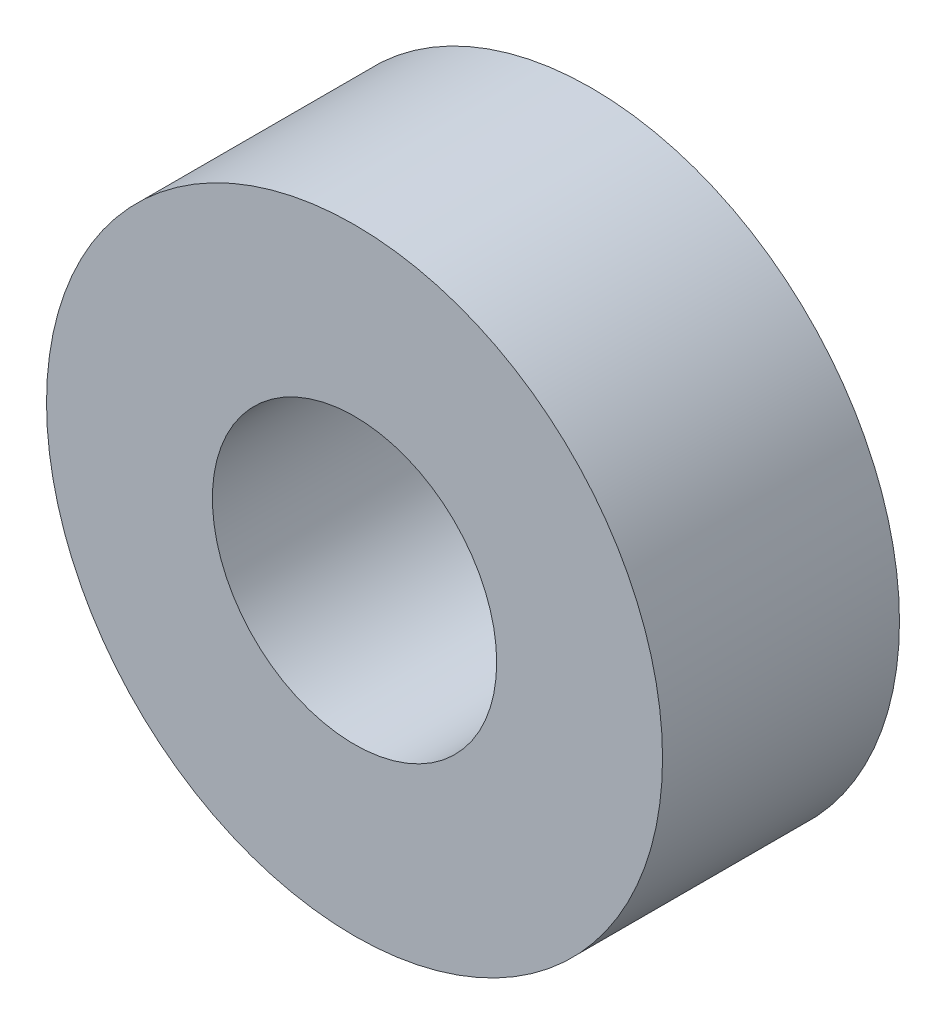
ISO-10303-21;
HEADER;
FILE_DESCRIPTION(('STEP AP214'),'2;1');
FILE_NAME('part.step','',(''),(''),'','','');
FILE_SCHEMA(('AUTOMOTIVE_DESIGN { 1 0 10303 214 1 1 1 1 }'));
ENDSEC;
DATA;
#1=APPLICATION_CONTEXT('core data for automotive mechanical design processes');
#2=APPLICATION_PROTOCOL_DEFINITION('international standard','automotive_design',2000,#1);
#3=PRODUCT_CONTEXT('',#1,'mechanical');
#4=PRODUCT('Part','Part','',(#3));
#5=PRODUCT_RELATED_PRODUCT_CATEGORY('part','',(#4));
#6=PRODUCT_DEFINITION_FORMATION('','',#4);
#7=PRODUCT_DEFINITION_CONTEXT('part definition',#1,'design');
#8=PRODUCT_DEFINITION('design','',#6,#7);
#9=PRODUCT_DEFINITION_SHAPE('','',#8);
#10=(LENGTH_UNIT() NAMED_UNIT(*) SI_UNIT(.MILLI.,.METRE.));
#11=(NAMED_UNIT(*) PLANE_ANGLE_UNIT() SI_UNIT($,.RADIAN.));
#12=(NAMED_UNIT(*) SI_UNIT($,.STERADIAN.) SOLID_ANGLE_UNIT());
#13=UNCERTAINTY_MEASURE_WITH_UNIT(LENGTH_MEASURE(1.E-05),#10,'distance_accuracy_value','');
#14=(GEOMETRIC_REPRESENTATION_CONTEXT(3) GLOBAL_UNCERTAINTY_ASSIGNED_CONTEXT((#13)) GLOBAL_UNIT_ASSIGNED_CONTEXT((#10,
#11,#12)) REPRESENTATION_CONTEXT('',''));
#15=CARTESIAN_POINT('',(0.,0.,0.));
#16=DIRECTION('',(0.,0.,1.));
#17=DIRECTION('',(1.,0.,0.));
#18=AXIS2_PLACEMENT_3D('',#15,#16,#17);
#19=CARTESIAN_POINT('',(0.,0.,5.));
#20=DIRECTION('',(0.,0.,-1.));
#21=DIRECTION('',(-1.,0.,0.));
#22=AXIS2_PLACEMENT_3D('',#19,#20,#21);
#23=CYLINDRICAL_SURFACE('',#22,6.5);
#24=CARTESIAN_POINT('',(0.,0.,5.));
#25=DIRECTION('',(0.,0.,1.));
#26=DIRECTION('',(1.,0.,0.));
#27=AXIS2_PLACEMENT_3D('',#24,#25,#26);
#28=CIRCLE('',#27,6.5);
#29=CARTESIAN_POINT('',(6.5,0.,5.));
#30=VERTEX_POINT('',#29);
#31=EDGE_CURVE('E10',#30,#30,#28,.T.);
#32=ORIENTED_EDGE('',*,*,#31,.F.);
#33=EDGE_LOOP('',(#32));
#34=FACE_BOUND('',#33,.T.);
#35=CARTESIAN_POINT('',(0.,0.,0.));
#36=DIRECTION('',(0.,0.,1.));
#37=DIRECTION('',(1.,0.,0.));
#38=AXIS2_PLACEMENT_3D('',#35,#36,#37);
#39=CIRCLE('',#38,6.5);
#40=CARTESIAN_POINT('',(6.5,0.,0.));
#41=VERTEX_POINT('',#40);
#42=EDGE_CURVE('E46',#41,#41,#39,.T.);
#43=ORIENTED_EDGE('',*,*,#42,.T.);
#44=EDGE_LOOP('',(#43));
#45=FACE_BOUND('',#44,.T.);
#46=ADVANCED_FACE('F43',(#34,#45),#23,.T.);
#47=CARTESIAN_POINT('',(0.,0.,5.));
#48=DIRECTION('',(0.,0.,1.));
#49=DIRECTION('',(1.,0.,0.));
#50=AXIS2_PLACEMENT_3D('',#47,#48,#49);
#51=PLANE('',#50);
#52=CARTESIAN_POINT('',(0.,0.,5.));
#53=DIRECTION('',(0.,0.,1.));
#54=DIRECTION('',(1.,0.,0.));
#55=AXIS2_PLACEMENT_3D('',#52,#53,#54);
#56=CIRCLE('',#55,3.);
#57=CARTESIAN_POINT('',(3.,0.,5.));
#58=VERTEX_POINT('',#57);
#59=EDGE_CURVE('E57',#58,#58,#56,.T.);
#60=ORIENTED_EDGE('',*,*,#59,.F.);
#61=EDGE_LOOP('',(#60));
#62=FACE_BOUND('',#61,.T.);
#63=ORIENTED_EDGE('',*,*,#31,.T.);
#64=EDGE_LOOP('',(#63));
#65=FACE_BOUND('',#64,.T.);
#66=ADVANCED_FACE('F74',(#62,#65),#51,.T.);
#67=CARTESIAN_POINT('',(0.,0.,0.));
#68=DIRECTION('',(0.,0.,1.));
#69=DIRECTION('',(1.,0.,0.));
#70=AXIS2_PLACEMENT_3D('',#67,#68,#69);
#71=PLANE('',#70);
#72=CARTESIAN_POINT('',(0.,0.,0.));
#73=DIRECTION('',(0.,0.,1.));
#74=DIRECTION('',(1.,0.,0.));
#75=AXIS2_PLACEMENT_3D('',#72,#73,#74);
#76=CIRCLE('',#75,3.);
#77=CARTESIAN_POINT('',(3.,0.,0.));
#78=VERTEX_POINT('',#77);
#79=EDGE_CURVE('E55',#78,#78,#76,.T.);
#80=ORIENTED_EDGE('',*,*,#79,.T.);
#81=EDGE_LOOP('',(#80));
#82=FACE_BOUND('',#81,.T.);
#83=ORIENTED_EDGE('',*,*,#42,.F.);
#84=EDGE_LOOP('',(#83));
#85=FACE_BOUND('',#84,.T.);
#86=ADVANCED_FACE('F65',(#82,#85),#71,.F.);
#87=CARTESIAN_POINT('',(0.,0.,0.));
#88=DIRECTION('',(0.,0.,1.));
#89=DIRECTION('',(1.,0.,0.));
#90=AXIS2_PLACEMENT_3D('',#87,#88,#89);
#91=CYLINDRICAL_SURFACE('',#90,3.);
#92=ORIENTED_EDGE('',*,*,#79,.F.);
#93=EDGE_LOOP('',(#92));
#94=FACE_BOUND('',#93,.T.);
#95=ORIENTED_EDGE('',*,*,#59,.T.);
#96=EDGE_LOOP('',(#95));
#97=FACE_BOUND('',#96,.T.);
#98=ADVANCED_FACE('F68',(#94,#97),#91,.F.);
#99=CLOSED_SHELL('',(#46,#66,#86,#98));
#100=MANIFOLD_SOLID_BREP('B2',#99);
#101=ADVANCED_BREP_SHAPE_REPRESENTATION('',(#18,#100),#14);
#102=SHAPE_DEFINITION_REPRESENTATION(#9,#101);
ENDSEC;
END-ISO-10303-21;
